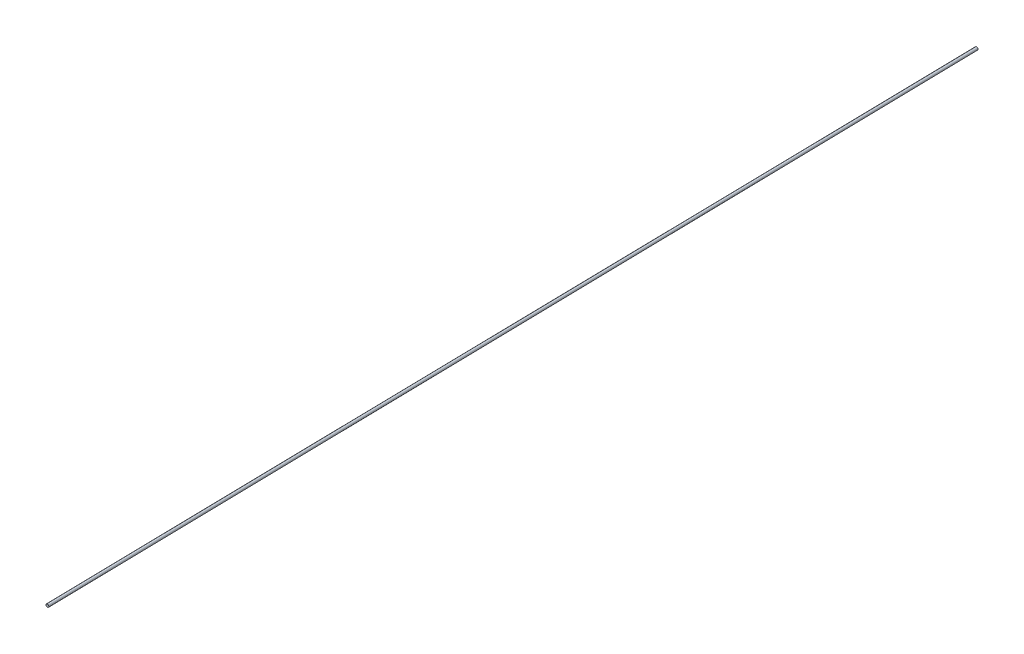
ISO-10303-21;
HEADER;
FILE_DESCRIPTION(('STEP AP214'),'2;1');
FILE_NAME('part.step','',(''),(''),'','','');
FILE_SCHEMA(('AUTOMOTIVE_DESIGN { 1 0 10303 214 1 1 1 1 }'));
ENDSEC;
DATA;
#1=APPLICATION_CONTEXT('core data for automotive mechanical design processes');
#2=APPLICATION_PROTOCOL_DEFINITION('international standard','automotive_design',2000,#1);
#3=PRODUCT_CONTEXT('',#1,'mechanical');
#4=PRODUCT('Part','Part','',(#3));
#5=PRODUCT_RELATED_PRODUCT_CATEGORY('part','',(#4));
#6=PRODUCT_DEFINITION_FORMATION('','',#4);
#7=PRODUCT_DEFINITION_CONTEXT('part definition',#1,'design');
#8=PRODUCT_DEFINITION('design','',#6,#7);
#9=PRODUCT_DEFINITION_SHAPE('','',#8);
#10=(LENGTH_UNIT() NAMED_UNIT(*) SI_UNIT(.MILLI.,.METRE.));
#11=(NAMED_UNIT(*) PLANE_ANGLE_UNIT() SI_UNIT($,.RADIAN.));
#12=(NAMED_UNIT(*) SI_UNIT($,.STERADIAN.) SOLID_ANGLE_UNIT());
#13=UNCERTAINTY_MEASURE_WITH_UNIT(LENGTH_MEASURE(1.E-05),#10,'distance_accuracy_value','');
#14=(GEOMETRIC_REPRESENTATION_CONTEXT(3) GLOBAL_UNCERTAINTY_ASSIGNED_CONTEXT((#13)) GLOBAL_UNIT_ASSIGNED_CONTEXT((#10,
#11,#12)) REPRESENTATION_CONTEXT('',''));
#15=CARTESIAN_POINT('',(0.,0.,0.));
#16=DIRECTION('',(0.,0.,1.));
#17=DIRECTION('',(1.,0.,0.));
#18=AXIS2_PLACEMENT_3D('',#15,#16,#17);
#19=CARTESIAN_POINT('',(0.,0.,0.));
#20=DIRECTION('',(0.,0.0193473585649338,-0.999812822340542));
#21=DIRECTION('',(0.,0.999812822340542,0.0193473585649338));
#22=AXIS2_PLACEMENT_3D('',#19,#20,#21);
#23=PLANE('',#22);
#24=CARTESIAN_POINT('',(0.,0.,0.));
#25=DIRECTION('',(0.,0.0193473585649338,-0.999812822340542));
#26=DIRECTION('',(0.,0.999812822340542,0.0193473585649338));
#27=AXIS2_PLACEMENT_3D('',#24,#25,#26);
#28=CIRCLE('',#27,1.5);
#29=CARTESIAN_POINT('',(0.,1.49971923351081,0.0290210378474007));
#30=VERTEX_POINT('',#29);
#31=EDGE_CURVE('E52',#30,#30,#28,.T.);
#32=ORIENTED_EDGE('',*,*,#31,.F.);
#33=EDGE_LOOP('',(#32));
#34=FACE_BOUND('',#33,.T.);
#35=ADVANCED_FACE('F45',(#34),#23,.F.);
#36=CARTESIAN_POINT('',(0.,18.9124299443941,-977.337030094327));
#37=DIRECTION('',(0.,0.0193473585649338,-0.999812822340542));
#38=DIRECTION('',(0.,0.999812822340542,0.0193473585649338));
#39=AXIS2_PLACEMENT_3D('',#36,#37,#38);
#40=PLANE('',#39);
#41=CARTESIAN_POINT('',(0.,18.9124299443941,-977.337030094327));
#42=DIRECTION('',(0.,0.0193473585649338,-0.999812822340542));
#43=DIRECTION('',(0.,0.999812822340542,0.0193473585649338));
#44=AXIS2_PLACEMENT_3D('',#41,#42,#43);
#45=CIRCLE('',#44,1.5);
#46=CARTESIAN_POINT('',(0.,20.4121491779049,-977.308009056479));
#47=VERTEX_POINT('',#46);
#48=EDGE_CURVE('E11',#47,#47,#45,.T.);
#49=ORIENTED_EDGE('',*,*,#48,.T.);
#50=EDGE_LOOP('',(#49));
#51=FACE_BOUND('',#50,.T.);
#52=ADVANCED_FACE('F62',(#51),#40,.T.);
#53=CARTESIAN_POINT('',(0.,0.,0.));
#54=DIRECTION('',(0.,0.0193473585649338,-0.999812822340542));
#55=DIRECTION('',(0.,0.999812822340542,0.0193473585649338));
#56=AXIS2_PLACEMENT_3D('',#53,#54,#55);
#57=CYLINDRICAL_SURFACE('',#56,1.5);
#58=ORIENTED_EDGE('',*,*,#48,.F.);
#59=EDGE_LOOP('',(#58));
#60=FACE_BOUND('',#59,.T.);
#61=ORIENTED_EDGE('',*,*,#31,.T.);
#62=EDGE_LOOP('',(#61));
#63=FACE_BOUND('',#62,.T.);
#64=ADVANCED_FACE('F59',(#60,#63),#57,.T.);
#65=CLOSED_SHELL('',(#35,#52,#64));
#66=MANIFOLD_SOLID_BREP('B2',#65);
#67=ADVANCED_BREP_SHAPE_REPRESENTATION('',(#18,#66),#14);
#68=SHAPE_DEFINITION_REPRESENTATION(#9,#67);
ENDSEC;
END-ISO-10303-21;
